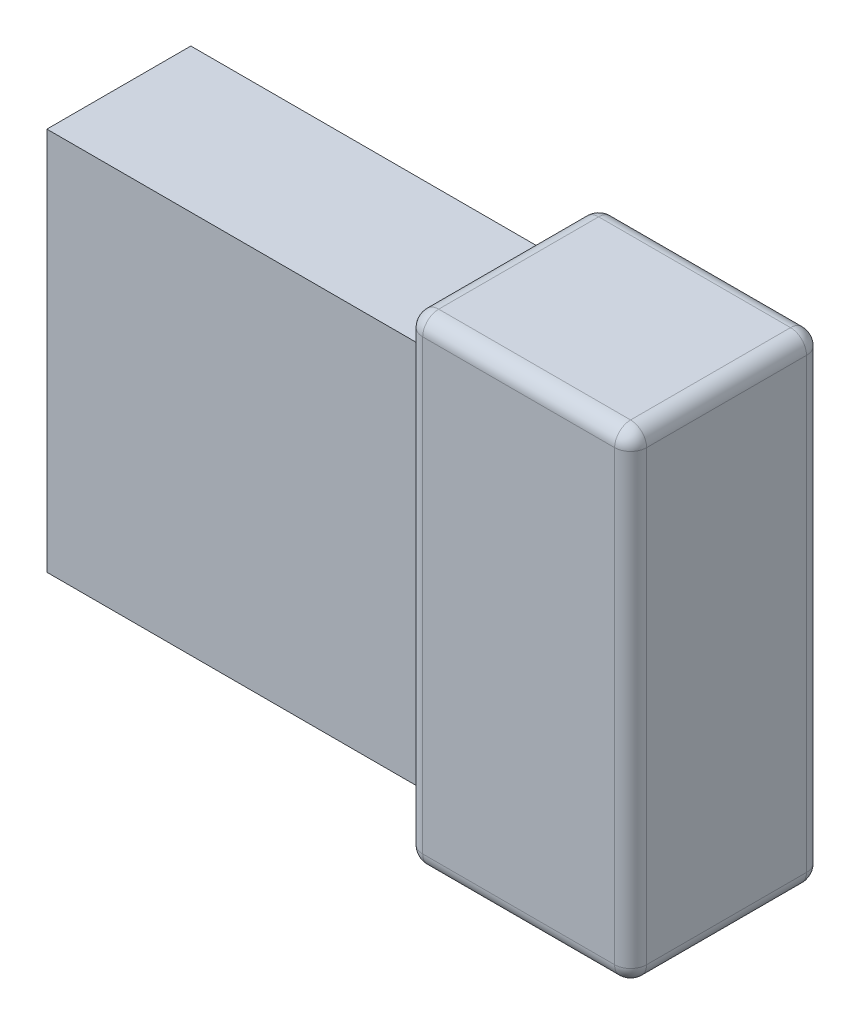
ISO-10303-21;
HEADER;
FILE_DESCRIPTION(('STEP AP214'),'2;1');
FILE_NAME('part.step','',(''),(''),'','','');
FILE_SCHEMA(('AUTOMOTIVE_DESIGN { 1 0 10303 214 1 1 1 1 }'));
ENDSEC;
DATA;
#1=APPLICATION_CONTEXT('core data for automotive mechanical design processes');
#2=APPLICATION_PROTOCOL_DEFINITION('international standard','automotive_design',2000,#1);
#3=PRODUCT_CONTEXT('',#1,'mechanical');
#4=PRODUCT('Part','Part','',(#3));
#5=PRODUCT_RELATED_PRODUCT_CATEGORY('part','',(#4));
#6=PRODUCT_DEFINITION_FORMATION('','',#4);
#7=PRODUCT_DEFINITION_CONTEXT('part definition',#1,'design');
#8=PRODUCT_DEFINITION('design','',#6,#7);
#9=PRODUCT_DEFINITION_SHAPE('','',#8);
#10=(LENGTH_UNIT() NAMED_UNIT(*) SI_UNIT(.MILLI.,.METRE.));
#11=(NAMED_UNIT(*) PLANE_ANGLE_UNIT() SI_UNIT($,.RADIAN.));
#12=(NAMED_UNIT(*) SI_UNIT($,.STERADIAN.) SOLID_ANGLE_UNIT());
#13=UNCERTAINTY_MEASURE_WITH_UNIT(LENGTH_MEASURE(1.E-05),#10,'distance_accuracy_value','');
#14=(GEOMETRIC_REPRESENTATION_CONTEXT(3) GLOBAL_UNCERTAINTY_ASSIGNED_CONTEXT((#13)) GLOBAL_UNIT_ASSIGNED_CONTEXT((#10,
#11,#12)) REPRESENTATION_CONTEXT('',''));
#15=CARTESIAN_POINT('',(0.,0.,0.));
#16=DIRECTION('',(0.,0.,1.));
#17=DIRECTION('',(1.,0.,0.));
#18=AXIS2_PLACEMENT_3D('',#15,#16,#17);
#19=CARTESIAN_POINT('',(-1.17961196366423E-13,-5.99999999999994,2.24999999999999));
#20=DIRECTION('',(0.,1.,0.));
#21=DIRECTION('',(0.,0.,1.));
#22=AXIS2_PLACEMENT_3D('',#19,#20,#21);
#23=PLANE('',#22);
#24=DIRECTION('',(1.,0.,0.));
#25=VECTOR('',#24,1.);
#26=CARTESIAN_POINT('',(-1.17961196366423E-13,-5.99999999999994,-2.25));
#27=LINE('',#26,#25);
#28=CARTESIAN_POINT('',(-6.00000000000011,-5.99999999999966,-2.25));
#29=VERTEX_POINT('',#28);
#30=CARTESIAN_POINT('',(5.99999999999992,-6.00000000000001,-2.25));
#31=VERTEX_POINT('',#30);
#32=EDGE_CURVE('E164',#29,#31,#27,.T.);
#33=ORIENTED_EDGE('',*,*,#32,.T.);
#34=DIRECTION('',(0.,0.,-1.));
#35=VECTOR('',#34,1.);
#36=CARTESIAN_POINT('',(5.99999999999992,-6.00000000000001,2.25));
#37=LINE('',#36,#35);
#38=CARTESIAN_POINT('',(5.99999999999992,-6.00000000000001,2.25));
#39=VERTEX_POINT('',#38);
#40=EDGE_CURVE('E168',#39,#31,#37,.T.);
#41=ORIENTED_EDGE('',*,*,#40,.F.);
#42=DIRECTION('',(1.,0.,0.));
#43=VECTOR('',#42,1.);
#44=CARTESIAN_POINT('',(-1.17961196366423E-13,-5.99999999999994,2.24999999999999));
#45=LINE('',#44,#43);
#46=CARTESIAN_POINT('',(-6.00000000000011,-5.99999999999966,2.25));
#47=VERTEX_POINT('',#46);
#48=EDGE_CURVE('E491',#47,#39,#45,.T.);
#49=ORIENTED_EDGE('',*,*,#48,.F.);
#50=DIRECTION('',(0.,0.,-1.));
#51=VECTOR('',#50,1.);
#52=CARTESIAN_POINT('',(-6.00000000000011,-5.99999999999966,2.25));
#53=LINE('',#52,#51);
#54=EDGE_CURVE('E170',#47,#29,#53,.T.);
#55=ORIENTED_EDGE('',*,*,#54,.T.);
#56=EDGE_LOOP('',(#33,#41,#49,#55));
#57=FACE_BOUND('',#56,.T.);
#58=ADVANCED_FACE('F38',(#57),#23,.F.);
#59=CARTESIAN_POINT('',(-1.04083408558608E-13,5.99999999999989,2.24999999999999));
#60=DIRECTION('',(0.,1.,0.));
#61=DIRECTION('',(0.,0.,1.));
#62=AXIS2_PLACEMENT_3D('',#59,#60,#61);
#63=PLANE('',#62);
#64=DIRECTION('',(1.,0.,0.));
#65=VECTOR('',#64,1.);
#66=CARTESIAN_POINT('',(-1.04083408558608E-13,5.99999999999989,-2.25));
#67=LINE('',#66,#65);
#68=CARTESIAN_POINT('',(-6.00000000000011,5.99999999999964,-2.25));
#69=VERTEX_POINT('',#68);
#70=CARTESIAN_POINT('',(5.99999999999992,6.00000000000001,-2.25));
#71=VERTEX_POINT('',#70);
#72=EDGE_CURVE('E181',#69,#71,#67,.T.);
#73=ORIENTED_EDGE('',*,*,#72,.F.);
#74=DIRECTION('',(0.,0.,-1.));
#75=VECTOR('',#74,1.);
#76=CARTESIAN_POINT('',(-6.00000000000011,5.99999999999964,2.25));
#77=LINE('',#76,#75);
#78=CARTESIAN_POINT('',(-6.00000000000011,5.99999999999964,2.25));
#79=VERTEX_POINT('',#78);
#80=EDGE_CURVE('E197',#79,#69,#77,.T.);
#81=ORIENTED_EDGE('',*,*,#80,.F.);
#82=DIRECTION('',(1.,0.,0.));
#83=VECTOR('',#82,1.);
#84=CARTESIAN_POINT('',(-1.04083408558608E-13,5.99999999999989,2.24999999999999));
#85=LINE('',#84,#83);
#86=CARTESIAN_POINT('',(5.99999999999992,6.00000000000001,2.25));
#87=VERTEX_POINT('',#86);
#88=EDGE_CURVE('E499',#79,#87,#85,.T.);
#89=ORIENTED_EDGE('',*,*,#88,.T.);
#90=DIRECTION('',(0.,0.,-1.));
#91=VECTOR('',#90,1.);
#92=CARTESIAN_POINT('',(5.99999999999992,6.00000000000001,2.25));
#93=LINE('',#92,#91);
#94=EDGE_CURVE('E190',#87,#71,#93,.T.);
#95=ORIENTED_EDGE('',*,*,#94,.T.);
#96=EDGE_LOOP('',(#73,#81,#89,#95));
#97=FACE_BOUND('',#96,.T.);
#98=ADVANCED_FACE('F422',(#97),#63,.T.);
#99=CARTESIAN_POINT('',(-6.00000000000001,0.,2.25));
#100=DIRECTION('',(-1.,0.,0.));
#101=DIRECTION('',(0.,0.,1.));
#102=AXIS2_PLACEMENT_3D('',#99,#100,#101);
#103=PLANE('',#102);
#104=DIRECTION('',(0.,1.,0.));
#105=VECTOR('',#104,1.);
#106=CARTESIAN_POINT('',(-6.00000000000001,0.,-2.25));
#107=LINE('',#106,#105);
#108=EDGE_CURVE('E489',#29,#69,#107,.T.);
#109=ORIENTED_EDGE('',*,*,#108,.F.);
#110=ORIENTED_EDGE('',*,*,#54,.F.);
#111=DIRECTION('',(0.,1.,0.));
#112=VECTOR('',#111,1.);
#113=CARTESIAN_POINT('',(-6.00000000000001,0.,2.25));
#114=LINE('',#113,#112);
#115=EDGE_CURVE('E498',#47,#79,#114,.T.);
#116=ORIENTED_EDGE('',*,*,#115,.T.);
#117=ORIENTED_EDGE('',*,*,#80,.T.);
#118=EDGE_LOOP('',(#109,#110,#116,#117));
#119=FACE_BOUND('',#118,.T.);
#120=ADVANCED_FACE('F427',(#119),#103,.T.);
#121=CARTESIAN_POINT('',(0.,0.,2.24999999999999));
#122=DIRECTION('',(0.,0.,1.));
#123=DIRECTION('',(1.,0.,0.));
#124=AXIS2_PLACEMENT_3D('',#121,#122,#123);
#125=PLANE('',#124);
#126=ORIENTED_EDGE('',*,*,#48,.T.);
#127=DIRECTION('',(0.,1.,0.));
#128=VECTOR('',#127,1.);
#129=CARTESIAN_POINT('',(6.00000000000001,0.,2.25));
#130=LINE('',#129,#128);
#131=EDGE_CURVE('E187',#39,#87,#130,.T.);
#132=ORIENTED_EDGE('',*,*,#131,.T.);
#133=ORIENTED_EDGE('',*,*,#88,.F.);
#134=ORIENTED_EDGE('',*,*,#115,.F.);
#135=EDGE_LOOP('',(#126,#132,#133,#134));
#136=FACE_BOUND('',#135,.T.);
#137=ADVANCED_FACE('F480',(#136),#125,.T.);
#138=CARTESIAN_POINT('',(0.,0.,-2.25));
#139=DIRECTION('',(0.,0.,1.));
#140=DIRECTION('',(1.,0.,0.));
#141=AXIS2_PLACEMENT_3D('',#138,#139,#140);
#142=PLANE('',#141);
#143=ORIENTED_EDGE('',*,*,#32,.F.);
#144=ORIENTED_EDGE('',*,*,#108,.T.);
#145=ORIENTED_EDGE('',*,*,#72,.T.);
#146=DIRECTION('',(0.,1.,0.));
#147=VECTOR('',#146,1.);
#148=CARTESIAN_POINT('',(6.00000000000001,0.,-2.25));
#149=LINE('',#148,#147);
#150=EDGE_CURVE('E175',#31,#71,#149,.T.);
#151=ORIENTED_EDGE('',*,*,#150,.F.);
#152=EDGE_LOOP('',(#143,#144,#145,#151));
#153=FACE_BOUND('',#152,.T.);
#154=ADVANCED_FACE('F179',(#153),#142,.F.);
#155=CARTESIAN_POINT('',(13.,-7.49999999999997,3.));
#156=DIRECTION('',(-1.,0.,0.));
#157=DIRECTION('',(0.,-1.,0.));
#158=AXIS2_PLACEMENT_3D('',#155,#156,#157);
#159=PLANE('',#158);
#160=DIRECTION('',(0.,0.,-1.));
#161=VECTOR('',#160,1.);
#162=CARTESIAN_POINT('',(13.,7.00000000000001,3.));
#163=LINE('',#162,#161);
#164=CARTESIAN_POINT('',(13.,7.00000000000001,-2.5));
#165=VERTEX_POINT('',#164);
#166=CARTESIAN_POINT('',(13.,7.00000000000001,2.5));
#167=VERTEX_POINT('',#166);
#168=EDGE_CURVE('E221',#165,#167,#163,.F.);
#169=ORIENTED_EDGE('',*,*,#168,.T.);
#170=DIRECTION('',(0.,1.,0.));
#171=VECTOR('',#170,1.);
#172=CARTESIAN_POINT('',(13.,-7.49999999999997,2.5));
#173=LINE('',#172,#171);
#174=CARTESIAN_POINT('',(13.,-7.00000000000001,2.5));
#175=VERTEX_POINT('',#174);
#176=EDGE_CURVE('E229',#167,#175,#173,.F.);
#177=ORIENTED_EDGE('',*,*,#176,.T.);
#178=DIRECTION('',(0.,0.,-1.));
#179=VECTOR('',#178,1.);
#180=CARTESIAN_POINT('',(13.,-7.00000000000001,-3.));
#181=LINE('',#180,#179);
#182=CARTESIAN_POINT('',(13.,-7.00000000000001,-2.5));
#183=VERTEX_POINT('',#182);
#184=EDGE_CURVE('E226',#175,#183,#181,.T.);
#185=ORIENTED_EDGE('',*,*,#184,.T.);
#186=DIRECTION('',(0.,1.,0.));
#187=VECTOR('',#186,1.);
#188=CARTESIAN_POINT('',(13.,-7.49999999999997,-2.5));
#189=LINE('',#188,#187);
#190=EDGE_CURVE('E223',#183,#165,#189,.T.);
#191=ORIENTED_EDGE('',*,*,#190,.T.);
#192=EDGE_LOOP('',(#169,#177,#185,#191));
#193=FACE_BOUND('',#192,.T.);
#194=ADVANCED_FACE('F388',(#193),#159,.F.);
#195=CARTESIAN_POINT('',(13.,7.49999999999997,3.));
#196=DIRECTION('',(0.,-1.,0.));
#197=DIRECTION('',(0.,0.,-1.));
#198=AXIS2_PLACEMENT_3D('',#195,#196,#197);
#199=PLANE('',#198);
#200=DIRECTION('',(-1.,0.,0.));
#201=VECTOR('',#200,1.);
#202=CARTESIAN_POINT('',(13.,7.49999999999997,2.5));
#203=LINE('',#202,#201);
#204=CARTESIAN_POINT('',(6.50000000000001,7.50000000000001,2.5));
#205=VERTEX_POINT('',#204);
#206=CARTESIAN_POINT('',(12.5,7.49999999999996,2.5));
#207=VERTEX_POINT('',#206);
#208=EDGE_CURVE('E47',#205,#207,#203,.F.);
#209=ORIENTED_EDGE('',*,*,#208,.T.);
#210=DIRECTION('',(0.,0.,-1.));
#211=VECTOR('',#210,1.);
#212=CARTESIAN_POINT('',(12.5,7.49999999999996,3.));
#213=LINE('',#212,#211);
#214=CARTESIAN_POINT('',(12.5,7.49999999999996,-2.5));
#215=VERTEX_POINT('',#214);
#216=EDGE_CURVE('E11',#207,#215,#213,.T.);
#217=ORIENTED_EDGE('',*,*,#216,.T.);
#218=DIRECTION('',(-1.,0.,0.));
#219=VECTOR('',#218,1.);
#220=CARTESIAN_POINT('',(13.,7.49999999999997,-2.5));
#221=LINE('',#220,#219);
#222=CARTESIAN_POINT('',(6.50000000000001,7.50000000000001,-2.5));
#223=VERTEX_POINT('',#222);
#224=EDGE_CURVE('E259',#215,#223,#221,.T.);
#225=ORIENTED_EDGE('',*,*,#224,.T.);
#226=DIRECTION('',(0.,0.,-1.));
#227=VECTOR('',#226,1.);
#228=CARTESIAN_POINT('',(6.50000000000001,7.50000000000001,3.));
#229=LINE('',#228,#227);
#230=EDGE_CURVE('E58',#223,#205,#229,.F.);
#231=ORIENTED_EDGE('',*,*,#230,.T.);
#232=EDGE_LOOP('',(#209,#217,#225,#231));
#233=FACE_BOUND('',#232,.T.);
#234=ADVANCED_FACE('F468',(#233),#199,.F.);
#235=CARTESIAN_POINT('',(5.99999999999999,-7.50000000000009,3.));
#236=DIRECTION('',(-1.,0.,0.));
#237=DIRECTION('',(0.,0.,1.));
#238=AXIS2_PLACEMENT_3D('',#235,#236,#237);
#239=PLANE('',#238);
#240=DIRECTION('',(0.,0.,-1.));
#241=VECTOR('',#240,1.);
#242=CARTESIAN_POINT('',(5.99999999999999,-7.00000000000009,3.));
#243=LINE('',#242,#241);
#244=CARTESIAN_POINT('',(5.99999999999999,-7.00000000000009,-2.5));
#245=VERTEX_POINT('',#244);
#246=CARTESIAN_POINT('',(5.99999999999999,-7.00000000000009,2.5));
#247=VERTEX_POINT('',#246);
#248=EDGE_CURVE('E203',#245,#247,#243,.F.);
#249=ORIENTED_EDGE('',*,*,#248,.T.);
#250=DIRECTION('',(0.,1.,0.));
#251=VECTOR('',#250,1.);
#252=CARTESIAN_POINT('',(5.99999999999999,-7.50000000000009,2.5));
#253=LINE('',#252,#251);
#254=CARTESIAN_POINT('',(6.00000000000001,7.00000000000009,2.5));
#255=VERTEX_POINT('',#254);
#256=EDGE_CURVE('E205',#247,#255,#253,.T.);
#257=ORIENTED_EDGE('',*,*,#256,.T.);
#258=DIRECTION('',(0.,0.,-1.));
#259=VECTOR('',#258,1.);
#260=CARTESIAN_POINT('',(6.00000000000001,7.00000000000009,-3.));
#261=LINE('',#260,#259);
#262=CARTESIAN_POINT('',(6.00000000000001,7.00000000000009,-2.5));
#263=VERTEX_POINT('',#262);
#264=EDGE_CURVE('E189',#255,#263,#261,.T.);
#265=ORIENTED_EDGE('',*,*,#264,.T.);
#266=DIRECTION('',(0.,1.,0.));
#267=VECTOR('',#266,1.);
#268=CARTESIAN_POINT('',(5.99999999999999,-7.50000000000009,-2.5));
#269=LINE('',#268,#267);
#270=EDGE_CURVE('E194',#263,#245,#269,.F.);
#271=ORIENTED_EDGE('',*,*,#270,.T.);
#272=EDGE_LOOP('',(#249,#257,#265,#271));
#273=FACE_BOUND('',#272,.T.);
#274=ORIENTED_EDGE('',*,*,#40,.T.);
#275=ORIENTED_EDGE('',*,*,#150,.T.);
#276=ORIENTED_EDGE('',*,*,#94,.F.);
#277=ORIENTED_EDGE('',*,*,#131,.F.);
#278=EDGE_LOOP('',(#274,#275,#276,#277));
#279=FACE_BOUND('',#278,.T.);
#280=ADVANCED_FACE('F186',(#273,#279),#239,.T.);
#281=CARTESIAN_POINT('',(13.,-7.49999999999997,3.));
#282=DIRECTION('',(0.,-1.,0.));
#283=DIRECTION('',(1.,0.,0.));
#284=AXIS2_PLACEMENT_3D('',#281,#282,#283);
#285=PLANE('',#284);
#286=DIRECTION('',(-1.,0.,0.));
#287=VECTOR('',#286,1.);
#288=CARTESIAN_POINT('',(13.,-7.49999999999997,2.5));
#289=LINE('',#288,#287);
#290=CARTESIAN_POINT('',(12.5,-7.49999999999997,2.5));
#291=VERTEX_POINT('',#290);
#292=CARTESIAN_POINT('',(6.49999999999999,-7.50000000000001,2.5));
#293=VERTEX_POINT('',#292);
#294=EDGE_CURVE('E239',#291,#293,#289,.T.);
#295=ORIENTED_EDGE('',*,*,#294,.T.);
#296=DIRECTION('',(0.,0.,-1.));
#297=VECTOR('',#296,1.);
#298=CARTESIAN_POINT('',(6.49999999999999,-7.50000000000001,3.));
#299=LINE('',#298,#297);
#300=CARTESIAN_POINT('',(6.49999999999999,-7.50000000000001,-2.5));
#301=VERTEX_POINT('',#300);
#302=EDGE_CURVE('E242',#293,#301,#299,.T.);
#303=ORIENTED_EDGE('',*,*,#302,.T.);
#304=DIRECTION('',(-1.,0.,0.));
#305=VECTOR('',#304,1.);
#306=CARTESIAN_POINT('',(13.,-7.49999999999997,-2.50000000000002));
#307=LINE('',#306,#305);
#308=CARTESIAN_POINT('',(12.5,-7.49999999999997,-2.5));
#309=VERTEX_POINT('',#308);
#310=EDGE_CURVE('E233',#301,#309,#307,.F.);
#311=ORIENTED_EDGE('',*,*,#310,.T.);
#312=DIRECTION('',(0.,0.,-1.));
#313=VECTOR('',#312,1.);
#314=CARTESIAN_POINT('',(12.5,-7.49999999999997,3.));
#315=LINE('',#314,#313);
#316=EDGE_CURVE('E236',#309,#291,#315,.F.);
#317=ORIENTED_EDGE('',*,*,#316,.T.);
#318=EDGE_LOOP('',(#295,#303,#311,#317));
#319=FACE_BOUND('',#318,.T.);
#320=ADVANCED_FACE('F359',(#319),#285,.T.);
#321=CARTESIAN_POINT('',(0.,0.,2.99999999999999));
#322=DIRECTION('',(0.,0.,1.));
#323=DIRECTION('',(1.,0.,0.));
#324=AXIS2_PLACEMENT_3D('',#321,#322,#323);
#325=PLANE('',#324);
#326=DIRECTION('',(0.,1.,0.));
#327=VECTOR('',#326,1.);
#328=CARTESIAN_POINT('',(6.50000000000001,0.,3.));
#329=LINE('',#328,#327);
#330=CARTESIAN_POINT('',(6.50000000000001,7.00000000000001,3.));
#331=VERTEX_POINT('',#330);
#332=CARTESIAN_POINT('',(6.49999999999999,-7.00000000000001,3.));
#333=VERTEX_POINT('',#332);
#334=EDGE_CURVE('E214',#331,#333,#329,.F.);
#335=ORIENTED_EDGE('',*,*,#334,.T.);
#336=DIRECTION('',(-1.,0.,0.));
#337=VECTOR('',#336,1.);
#338=CARTESIAN_POINT('',(0.,-6.99999999999994,2.99999999999999));
#339=LINE('',#338,#337);
#340=CARTESIAN_POINT('',(12.5,-7.00000000000001,3.));
#341=VERTEX_POINT('',#340);
#342=EDGE_CURVE('E218',#333,#341,#339,.F.);
#343=ORIENTED_EDGE('',*,*,#342,.T.);
#344=DIRECTION('',(0.,1.,0.));
#345=VECTOR('',#344,1.);
#346=CARTESIAN_POINT('',(12.5,7.49999999999996,3.));
#347=LINE('',#346,#345);
#348=CARTESIAN_POINT('',(12.5,7.,3.));
#349=VERTEX_POINT('',#348);
#350=EDGE_CURVE('E211',#341,#349,#347,.T.);
#351=ORIENTED_EDGE('',*,*,#350,.T.);
#352=DIRECTION('',(-1.,0.,0.));
#353=VECTOR('',#352,1.);
#354=CARTESIAN_POINT('',(6.00000000000001,7.00000000000009,3.));
#355=LINE('',#354,#353);
#356=EDGE_CURVE('E209',#349,#331,#355,.T.);
#357=ORIENTED_EDGE('',*,*,#356,.T.);
#358=EDGE_LOOP('',(#335,#343,#351,#357));
#359=FACE_BOUND('',#358,.T.);
#360=ADVANCED_FACE('F462',(#359),#325,.T.);
#361=CARTESIAN_POINT('',(0.,0.,-3.));
#362=DIRECTION('',(0.,0.,1.));
#363=DIRECTION('',(1.,0.,0.));
#364=AXIS2_PLACEMENT_3D('',#361,#362,#363);
#365=PLANE('',#364);
#366=DIRECTION('',(-1.,0.,0.));
#367=VECTOR('',#366,1.);
#368=CARTESIAN_POINT('',(5.99999999999999,-7.00000000000009,-3.));
#369=LINE('',#368,#367);
#370=CARTESIAN_POINT('',(12.5,-7.00000000000001,-3.));
#371=VERTEX_POINT('',#370);
#372=CARTESIAN_POINT('',(6.49999999999999,-7.00000000000001,-3.));
#373=VERTEX_POINT('',#372);
#374=EDGE_CURVE('E252',#371,#373,#369,.T.);
#375=ORIENTED_EDGE('',*,*,#374,.T.);
#376=DIRECTION('',(0.,1.,0.));
#377=VECTOR('',#376,1.);
#378=CARTESIAN_POINT('',(6.50000000000001,7.50000000000001,-3.));
#379=LINE('',#378,#377);
#380=CARTESIAN_POINT('',(6.50000000000001,7.00000000000001,-3.));
#381=VERTEX_POINT('',#380);
#382=EDGE_CURVE('E255',#373,#381,#379,.T.);
#383=ORIENTED_EDGE('',*,*,#382,.T.);
#384=DIRECTION('',(-1.,0.,0.));
#385=VECTOR('',#384,1.);
#386=CARTESIAN_POINT('',(0.,6.99999999999987,-3.));
#387=LINE('',#386,#385);
#388=CARTESIAN_POINT('',(12.5,7.,-3.));
#389=VERTEX_POINT('',#388);
#390=EDGE_CURVE('E246',#381,#389,#387,.F.);
#391=ORIENTED_EDGE('',*,*,#390,.T.);
#392=DIRECTION('',(0.,1.,0.));
#393=VECTOR('',#392,1.);
#394=CARTESIAN_POINT('',(12.5,0.,-3.));
#395=LINE('',#394,#393);
#396=EDGE_CURVE('E249',#389,#371,#395,.F.);
#397=ORIENTED_EDGE('',*,*,#396,.T.);
#398=EDGE_LOOP('',(#375,#383,#391,#397));
#399=FACE_BOUND('',#398,.T.);
#400=ADVANCED_FACE('F368',(#399),#365,.F.);
#401=CARTESIAN_POINT('',(12.5,-7.49999999999997,-2.5));
#402=DIRECTION('',(0.,1.,0.));
#403=DIRECTION('',(-1.,0.,0.));
#404=AXIS2_PLACEMENT_3D('',#401,#402,#403);
#405=CYLINDRICAL_SURFACE('',#404,0.5);
#406=CARTESIAN_POINT('',(12.5,-7.00000000000001,-2.5));
#407=DIRECTION('',(0.,-1.,0.));
#408=DIRECTION('',(0.,0.,-1.));
#409=AXIS2_PLACEMENT_3D('',#406,#407,#408);
#410=CIRCLE('',#409,0.5);
#411=EDGE_CURVE('E42',#371,#183,#410,.T.);
#412=ORIENTED_EDGE('',*,*,#411,.F.);
#413=ORIENTED_EDGE('',*,*,#396,.F.);
#414=CARTESIAN_POINT('',(12.5,7.,-2.5));
#415=DIRECTION('',(0.,1.,0.));
#416=DIRECTION('',(0.,0.,1.));
#417=AXIS2_PLACEMENT_3D('',#414,#415,#416);
#418=CIRCLE('',#417,0.5);
#419=EDGE_CURVE('E335',#165,#389,#418,.T.);
#420=ORIENTED_EDGE('',*,*,#419,.F.);
#421=ORIENTED_EDGE('',*,*,#190,.F.);
#422=EDGE_LOOP('',(#412,#413,#420,#421));
#423=FACE_BOUND('',#422,.T.);
#424=ADVANCED_FACE('F40',(#423),#405,.T.);
#425=CARTESIAN_POINT('',(12.5,-7.00000000000001,-2.5));
#426=DIRECTION('',(0.,0.,1.));
#427=DIRECTION('',(1.,0.,0.));
#428=AXIS2_PLACEMENT_3D('',#425,#426,#427);
#429=SPHERICAL_SURFACE('',#428,0.5);
#430=CARTESIAN_POINT('',(12.5,-7.00000000000001,-2.5));
#431=DIRECTION('',(1.,0.,0.));
#432=DIRECTION('',(0.,0.,-1.));
#433=AXIS2_PLACEMENT_3D('',#430,#431,#432);
#434=CIRCLE('',#433,0.5);
#435=EDGE_CURVE('E328',#371,#309,#434,.F.);
#436=ORIENTED_EDGE('',*,*,#435,.F.);
#437=ORIENTED_EDGE('',*,*,#411,.T.);
#438=CARTESIAN_POINT('',(12.5,-7.00000000000001,-2.5));
#439=DIRECTION('',(0.,0.,-1.));
#440=DIRECTION('',(0.,1.,0.));
#441=AXIS2_PLACEMENT_3D('',#438,#439,#440);
#442=CIRCLE('',#441,0.5);
#443=EDGE_CURVE('E332',#309,#183,#442,.F.);
#444=ORIENTED_EDGE('',*,*,#443,.F.);
#445=EDGE_LOOP('',(#436,#437,#444));
#446=FACE_BOUND('',#445,.T.);
#447=ADVANCED_FACE('F347',(#446),#429,.T.);
#448=CARTESIAN_POINT('',(12.5,7.,-2.5));
#449=DIRECTION('',(0.,0.,1.));
#450=DIRECTION('',(1.,0.,0.));
#451=AXIS2_PLACEMENT_3D('',#448,#449,#450);
#452=SPHERICAL_SURFACE('',#451,0.5);
#453=CARTESIAN_POINT('',(12.5,7.,-2.5));
#454=DIRECTION('',(0.,0.,-1.));
#455=DIRECTION('',(-1.,0.,0.));
#456=AXIS2_PLACEMENT_3D('',#453,#454,#455);
#457=CIRCLE('',#456,0.5);
#458=EDGE_CURVE('E322',#165,#215,#457,.F.);
#459=ORIENTED_EDGE('',*,*,#458,.F.);
#460=ORIENTED_EDGE('',*,*,#419,.T.);
#461=CARTESIAN_POINT('',(12.5,7.,-2.5));
#462=DIRECTION('',(1.,0.,0.));
#463=DIRECTION('',(0.,0.,-1.));
#464=AXIS2_PLACEMENT_3D('',#461,#462,#463);
#465=CIRCLE('',#464,0.5);
#466=EDGE_CURVE('E325',#215,#389,#465,.F.);
#467=ORIENTED_EDGE('',*,*,#466,.F.);
#468=EDGE_LOOP('',(#459,#460,#467));
#469=FACE_BOUND('',#468,.T.);
#470=ADVANCED_FACE('F382',(#469),#452,.T.);
#471=CARTESIAN_POINT('',(12.5,-7.00000000000001,3.));
#472=DIRECTION('',(0.,0.,1.));
#473=DIRECTION('',(1.,0.,0.));
#474=AXIS2_PLACEMENT_3D('',#471,#472,#473);
#475=CYLINDRICAL_SURFACE('',#474,0.5);
#476=ORIENTED_EDGE('',*,*,#443,.T.);
#477=ORIENTED_EDGE('',*,*,#184,.F.);
#478=CARTESIAN_POINT('',(12.5,-7.00000000000001,2.5));
#479=DIRECTION('',(0.,0.,1.));
#480=DIRECTION('',(1.,0.,0.));
#481=AXIS2_PLACEMENT_3D('',#478,#479,#480);
#482=CIRCLE('',#481,0.5);
#483=EDGE_CURVE('E317',#291,#175,#482,.T.);
#484=ORIENTED_EDGE('',*,*,#483,.F.);
#485=ORIENTED_EDGE('',*,*,#316,.F.);
#486=EDGE_LOOP('',(#476,#477,#484,#485));
#487=FACE_BOUND('',#486,.T.);
#488=ADVANCED_FACE('F355',(#487),#475,.T.);
#489=CARTESIAN_POINT('',(0.,-6.99999999999994,-2.5));
#490=DIRECTION('',(1.,0.,0.));
#491=DIRECTION('',(0.,1.,0.));
#492=AXIS2_PLACEMENT_3D('',#489,#490,#491);
#493=CYLINDRICAL_SURFACE('',#492,0.5);
#494=ORIENTED_EDGE('',*,*,#435,.T.);
#495=ORIENTED_EDGE('',*,*,#310,.F.);
#496=CARTESIAN_POINT('',(6.49999999999999,-7.00000000000001,-2.5));
#497=DIRECTION('',(-1.,0.,0.));
#498=DIRECTION('',(0.,0.,1.));
#499=AXIS2_PLACEMENT_3D('',#496,#497,#498);
#500=CIRCLE('',#499,0.5);
#501=EDGE_CURVE('E313',#373,#301,#500,.T.);
#502=ORIENTED_EDGE('',*,*,#501,.F.);
#503=ORIENTED_EDGE('',*,*,#374,.F.);
#504=EDGE_LOOP('',(#494,#495,#502,#503));
#505=FACE_BOUND('',#504,.T.);
#506=ADVANCED_FACE('F365',(#505),#493,.T.);
#507=CARTESIAN_POINT('',(6.50000000000001,0.,-2.5));
#508=DIRECTION('',(0.,-1.,0.));
#509=DIRECTION('',(0.,0.,-1.));
#510=AXIS2_PLACEMENT_3D('',#507,#508,#509);
#511=CYLINDRICAL_SURFACE('',#510,0.5);
#512=CARTESIAN_POINT('',(6.50000000000001,7.00000000000001,-2.5));
#513=DIRECTION('',(0.,1.,0.));
#514=DIRECTION('',(0.,0.,1.));
#515=AXIS2_PLACEMENT_3D('',#512,#513,#514);
#516=CIRCLE('',#515,0.5);
#517=EDGE_CURVE('E305',#381,#263,#516,.T.);
#518=ORIENTED_EDGE('',*,*,#517,.F.);
#519=ORIENTED_EDGE('',*,*,#382,.F.);
#520=CARTESIAN_POINT('',(6.49999999999999,-7.00000000000001,-2.5));
#521=DIRECTION('',(0.,-1.,0.));
#522=DIRECTION('',(0.,0.,-1.));
#523=AXIS2_PLACEMENT_3D('',#520,#521,#522);
#524=CIRCLE('',#523,0.5);
#525=EDGE_CURVE('E309',#245,#373,#524,.T.);
#526=ORIENTED_EDGE('',*,*,#525,.F.);
#527=ORIENTED_EDGE('',*,*,#270,.F.);
#528=EDGE_LOOP('',(#518,#519,#526,#527));
#529=FACE_BOUND('',#528,.T.);
#530=ADVANCED_FACE('F372',(#529),#511,.T.);
#531=CARTESIAN_POINT('',(13.,7.00000000000001,-2.5));
#532=DIRECTION('',(-1.,0.,0.));
#533=DIRECTION('',(0.,0.,1.));
#534=AXIS2_PLACEMENT_3D('',#531,#532,#533);
#535=CYLINDRICAL_SURFACE('',#534,0.5);
#536=ORIENTED_EDGE('',*,*,#466,.T.);
#537=ORIENTED_EDGE('',*,*,#390,.F.);
#538=CARTESIAN_POINT('',(6.50000000000001,7.00000000000001,-2.5));
#539=DIRECTION('',(-1.,0.,0.));
#540=DIRECTION('',(0.,0.,1.));
#541=AXIS2_PLACEMENT_3D('',#538,#539,#540);
#542=CIRCLE('',#541,0.5);
#543=EDGE_CURVE('E302',#223,#381,#542,.T.);
#544=ORIENTED_EDGE('',*,*,#543,.F.);
#545=ORIENTED_EDGE('',*,*,#224,.F.);
#546=EDGE_LOOP('',(#536,#537,#544,#545));
#547=FACE_BOUND('',#546,.T.);
#548=ADVANCED_FACE('F380',(#547),#535,.T.);
#549=CARTESIAN_POINT('',(12.5,7.,3.));
#550=DIRECTION('',(0.,0.,-1.));
#551=DIRECTION('',(-1.,0.,0.));
#552=AXIS2_PLACEMENT_3D('',#549,#550,#551);
#553=CYLINDRICAL_SURFACE('',#552,0.5);
#554=ORIENTED_EDGE('',*,*,#458,.T.);
#555=ORIENTED_EDGE('',*,*,#216,.F.);
#556=CARTESIAN_POINT('',(12.5,7.,2.5));
#557=DIRECTION('',(0.,0.,1.));
#558=DIRECTION('',(1.,0.,0.));
#559=AXIS2_PLACEMENT_3D('',#556,#557,#558);
#560=CIRCLE('',#559,0.5);
#561=EDGE_CURVE('E299',#167,#207,#560,.T.);
#562=ORIENTED_EDGE('',*,*,#561,.F.);
#563=ORIENTED_EDGE('',*,*,#168,.F.);
#564=EDGE_LOOP('',(#554,#555,#562,#563));
#565=FACE_BOUND('',#564,.T.);
#566=ADVANCED_FACE('F385',(#565),#553,.T.);
#567=CARTESIAN_POINT('',(12.5,0.,2.5));
#568=DIRECTION('',(0.,-1.,0.));
#569=DIRECTION('',(1.,0.,0.));
#570=AXIS2_PLACEMENT_3D('',#567,#568,#569);
#571=CYLINDRICAL_SURFACE('',#570,0.5);
#572=CARTESIAN_POINT('',(12.5,-7.00000000000001,2.5));
#573=DIRECTION('',(0.,-1.,0.));
#574=DIRECTION('',(0.,0.,-1.));
#575=AXIS2_PLACEMENT_3D('',#572,#573,#574);
#576=CIRCLE('',#575,0.5);
#577=EDGE_CURVE('E319',#175,#341,#576,.T.);
#578=ORIENTED_EDGE('',*,*,#577,.F.);
#579=ORIENTED_EDGE('',*,*,#176,.F.);
#580=CARTESIAN_POINT('',(12.5,7.,2.5));
#581=DIRECTION('',(0.,1.,0.));
#582=DIRECTION('',(0.,0.,1.));
#583=AXIS2_PLACEMENT_3D('',#580,#581,#582);
#584=CIRCLE('',#583,0.5);
#585=EDGE_CURVE('E296',#349,#167,#584,.T.);
#586=ORIENTED_EDGE('',*,*,#585,.F.);
#587=ORIENTED_EDGE('',*,*,#350,.F.);
#588=EDGE_LOOP('',(#578,#579,#586,#587));
#589=FACE_BOUND('',#588,.T.);
#590=ADVANCED_FACE('F392',(#589),#571,.T.);
#591=CARTESIAN_POINT('',(12.5,-7.00000000000001,2.5));
#592=DIRECTION('',(0.,0.,1.));
#593=DIRECTION('',(1.,0.,0.));
#594=AXIS2_PLACEMENT_3D('',#591,#592,#593);
#595=SPHERICAL_SURFACE('',#594,0.5);
#596=ORIENTED_EDGE('',*,*,#483,.T.);
#597=ORIENTED_EDGE('',*,*,#577,.T.);
#598=CARTESIAN_POINT('',(12.5,-7.00000000000001,2.5));
#599=DIRECTION('',(1.,0.,0.));
#600=DIRECTION('',(0.,1.,0.));
#601=AXIS2_PLACEMENT_3D('',#598,#599,#600);
#602=CIRCLE('',#601,0.5);
#603=EDGE_CURVE('E293',#291,#341,#602,.F.);
#604=ORIENTED_EDGE('',*,*,#603,.F.);
#605=EDGE_LOOP('',(#596,#597,#604));
#606=FACE_BOUND('',#605,.T.);
#607=ADVANCED_FACE('F396',(#606),#595,.T.);
#608=CARTESIAN_POINT('',(6.49999999999999,-7.00000000000001,-2.5));
#609=DIRECTION('',(0.,0.,1.));
#610=DIRECTION('',(1.,0.,0.));
#611=AXIS2_PLACEMENT_3D('',#608,#609,#610);
#612=SPHERICAL_SURFACE('',#611,0.5);
#613=ORIENTED_EDGE('',*,*,#525,.T.);
#614=ORIENTED_EDGE('',*,*,#501,.T.);
#615=CARTESIAN_POINT('',(6.49999999999999,-7.00000000000001,-2.5));
#616=DIRECTION('',(0.,0.,-1.));
#617=DIRECTION('',(-1.,0.,0.));
#618=AXIS2_PLACEMENT_3D('',#615,#616,#617);
#619=CIRCLE('',#618,0.5);
#620=EDGE_CURVE('E291',#245,#301,#619,.F.);
#621=ORIENTED_EDGE('',*,*,#620,.F.);
#622=EDGE_LOOP('',(#613,#614,#621));
#623=FACE_BOUND('',#622,.T.);
#624=ADVANCED_FACE('F410',(#623),#612,.T.);
#625=CARTESIAN_POINT('',(6.50000000000001,7.00000000000001,-2.5));
#626=DIRECTION('',(0.,0.,1.));
#627=DIRECTION('',(1.,0.,0.));
#628=AXIS2_PLACEMENT_3D('',#625,#626,#627);
#629=SPHERICAL_SURFACE('',#628,0.5);
#630=ORIENTED_EDGE('',*,*,#543,.T.);
#631=ORIENTED_EDGE('',*,*,#517,.T.);
#632=CARTESIAN_POINT('',(6.50000000000001,7.00000000000001,-2.5));
#633=DIRECTION('',(0.,0.,-1.));
#634=DIRECTION('',(0.,1.,0.));
#635=AXIS2_PLACEMENT_3D('',#632,#633,#634);
#636=CIRCLE('',#635,0.5);
#637=EDGE_CURVE('E287',#223,#263,#636,.F.);
#638=ORIENTED_EDGE('',*,*,#637,.F.);
#639=EDGE_LOOP('',(#630,#631,#638));
#640=FACE_BOUND('',#639,.T.);
#641=ADVANCED_FACE('F412',(#640),#629,.T.);
#642=CARTESIAN_POINT('',(12.5,7.,2.5));
#643=DIRECTION('',(0.,0.,1.));
#644=DIRECTION('',(1.,0.,0.));
#645=AXIS2_PLACEMENT_3D('',#642,#643,#644);
#646=SPHERICAL_SURFACE('',#645,0.5);
#647=ORIENTED_EDGE('',*,*,#585,.T.);
#648=ORIENTED_EDGE('',*,*,#561,.T.);
#649=CARTESIAN_POINT('',(12.5,7.,2.5));
#650=DIRECTION('',(1.,0.,0.));
#651=DIRECTION('',(0.,0.,-1.));
#652=AXIS2_PLACEMENT_3D('',#649,#650,#651);
#653=CIRCLE('',#652,0.5);
#654=EDGE_CURVE('E284',#349,#207,#653,.F.);
#655=ORIENTED_EDGE('',*,*,#654,.F.);
#656=EDGE_LOOP('',(#647,#648,#655));
#657=FACE_BOUND('',#656,.T.);
#658=ADVANCED_FACE('F418',(#657),#646,.T.);
#659=CARTESIAN_POINT('',(13.,-7.00000000000001,2.5));
#660=DIRECTION('',(-1.,0.,0.));
#661=DIRECTION('',(0.,-1.,0.));
#662=AXIS2_PLACEMENT_3D('',#659,#660,#661);
#663=CYLINDRICAL_SURFACE('',#662,0.5);
#664=ORIENTED_EDGE('',*,*,#603,.T.);
#665=ORIENTED_EDGE('',*,*,#342,.F.);
#666=CARTESIAN_POINT('',(6.49999999999999,-7.00000000000001,2.5));
#667=DIRECTION('',(-1.,0.,0.));
#668=DIRECTION('',(0.,0.,1.));
#669=AXIS2_PLACEMENT_3D('',#666,#667,#668);
#670=CIRCLE('',#669,0.5);
#671=EDGE_CURVE('E280',#293,#333,#670,.T.);
#672=ORIENTED_EDGE('',*,*,#671,.F.);
#673=ORIENTED_EDGE('',*,*,#294,.F.);
#674=EDGE_LOOP('',(#664,#665,#672,#673));
#675=FACE_BOUND('',#674,.T.);
#676=ADVANCED_FACE('F399',(#675),#663,.T.);
#677=CARTESIAN_POINT('',(6.49999999999999,-7.00000000000001,3.));
#678=DIRECTION('',(0.,0.,-1.));
#679=DIRECTION('',(-1.,0.,0.));
#680=AXIS2_PLACEMENT_3D('',#677,#678,#679);
#681=CYLINDRICAL_SURFACE('',#680,0.5);
#682=ORIENTED_EDGE('',*,*,#620,.T.);
#683=ORIENTED_EDGE('',*,*,#302,.F.);
#684=CARTESIAN_POINT('',(6.49999999999999,-7.00000000000001,2.5));
#685=DIRECTION('',(0.,0.,1.));
#686=DIRECTION('',(1.,0.,0.));
#687=AXIS2_PLACEMENT_3D('',#684,#685,#686);
#688=CIRCLE('',#687,0.5);
#689=EDGE_CURVE('E276',#247,#293,#688,.T.);
#690=ORIENTED_EDGE('',*,*,#689,.F.);
#691=ORIENTED_EDGE('',*,*,#248,.F.);
#692=EDGE_LOOP('',(#682,#683,#690,#691));
#693=FACE_BOUND('',#692,.T.);
#694=ADVANCED_FACE('F408',(#693),#681,.T.);
#695=CARTESIAN_POINT('',(6.50000000000001,7.00000000000001,3.));
#696=DIRECTION('',(0.,0.,1.));
#697=DIRECTION('',(1.,0.,0.));
#698=AXIS2_PLACEMENT_3D('',#695,#696,#697);
#699=CYLINDRICAL_SURFACE('',#698,0.5);
#700=ORIENTED_EDGE('',*,*,#637,.T.);
#701=ORIENTED_EDGE('',*,*,#264,.F.);
#702=CARTESIAN_POINT('',(6.50000000000001,7.00000000000001,2.5));
#703=DIRECTION('',(0.,0.,1.));
#704=DIRECTION('',(1.,0.,0.));
#705=AXIS2_PLACEMENT_3D('',#702,#703,#704);
#706=CIRCLE('',#705,0.5);
#707=EDGE_CURVE('E273',#205,#255,#706,.T.);
#708=ORIENTED_EDGE('',*,*,#707,.F.);
#709=ORIENTED_EDGE('',*,*,#230,.F.);
#710=EDGE_LOOP('',(#700,#701,#708,#709));
#711=FACE_BOUND('',#710,.T.);
#712=ADVANCED_FACE('F445',(#711),#699,.T.);
#713=CARTESIAN_POINT('',(0.,6.99999999999987,2.49999999999999));
#714=DIRECTION('',(1.,0.,0.));
#715=DIRECTION('',(0.,0.,-1.));
#716=AXIS2_PLACEMENT_3D('',#713,#714,#715);
#717=CYLINDRICAL_SURFACE('',#716,0.5);
#718=ORIENTED_EDGE('',*,*,#654,.T.);
#719=ORIENTED_EDGE('',*,*,#208,.F.);
#720=CARTESIAN_POINT('',(6.50000000000001,7.00000000000001,2.5));
#721=DIRECTION('',(-1.,0.,0.));
#722=DIRECTION('',(0.,0.,1.));
#723=AXIS2_PLACEMENT_3D('',#720,#721,#722);
#724=CIRCLE('',#723,0.5);
#725=EDGE_CURVE('E270',#331,#205,#724,.T.);
#726=ORIENTED_EDGE('',*,*,#725,.F.);
#727=ORIENTED_EDGE('',*,*,#356,.F.);
#728=EDGE_LOOP('',(#718,#719,#726,#727));
#729=FACE_BOUND('',#728,.T.);
#730=ADVANCED_FACE('F442',(#729),#717,.T.);
#731=CARTESIAN_POINT('',(6.49999999999999,-7.00000000000001,2.5));
#732=DIRECTION('',(0.,0.,1.));
#733=DIRECTION('',(1.,0.,0.));
#734=AXIS2_PLACEMENT_3D('',#731,#732,#733);
#735=SPHERICAL_SURFACE('',#734,0.5);
#736=ORIENTED_EDGE('',*,*,#689,.T.);
#737=ORIENTED_EDGE('',*,*,#671,.T.);
#738=CARTESIAN_POINT('',(6.49999999999999,-7.00000000000001,2.5));
#739=DIRECTION('',(0.,-1.,0.));
#740=DIRECTION('',(0.,0.,-1.));
#741=AXIS2_PLACEMENT_3D('',#738,#739,#740);
#742=CIRCLE('',#741,0.5);
#743=EDGE_CURVE('E267',#247,#333,#742,.F.);
#744=ORIENTED_EDGE('',*,*,#743,.F.);
#745=EDGE_LOOP('',(#736,#737,#744));
#746=FACE_BOUND('',#745,.T.);
#747=ADVANCED_FACE('F404',(#746),#735,.T.);
#748=CARTESIAN_POINT('',(6.50000000000001,7.00000000000001,2.5));
#749=DIRECTION('',(0.,0.,1.));
#750=DIRECTION('',(1.,0.,0.));
#751=AXIS2_PLACEMENT_3D('',#748,#749,#750);
#752=SPHERICAL_SURFACE('',#751,0.5);
#753=ORIENTED_EDGE('',*,*,#725,.T.);
#754=ORIENTED_EDGE('',*,*,#707,.T.);
#755=CARTESIAN_POINT('',(6.50000000000001,7.00000000000001,2.5));
#756=DIRECTION('',(0.,1.,0.));
#757=DIRECTION('',(0.,0.,1.));
#758=AXIS2_PLACEMENT_3D('',#755,#756,#757);
#759=CIRCLE('',#758,0.5);
#760=EDGE_CURVE('E265',#331,#255,#759,.F.);
#761=ORIENTED_EDGE('',*,*,#760,.F.);
#762=EDGE_LOOP('',(#753,#754,#761));
#763=FACE_BOUND('',#762,.T.);
#764=ADVANCED_FACE('F435',(#763),#752,.T.);
#765=CARTESIAN_POINT('',(6.49999999999999,-7.50000000000001,2.5));
#766=DIRECTION('',(0.,1.,0.));
#767=DIRECTION('',(0.,0.,1.));
#768=AXIS2_PLACEMENT_3D('',#765,#766,#767);
#769=CYLINDRICAL_SURFACE('',#768,0.5);
#770=ORIENTED_EDGE('',*,*,#743,.T.);
#771=ORIENTED_EDGE('',*,*,#334,.F.);
#772=ORIENTED_EDGE('',*,*,#760,.T.);
#773=ORIENTED_EDGE('',*,*,#256,.F.);
#774=EDGE_LOOP('',(#770,#771,#772,#773));
#775=FACE_BOUND('',#774,.T.);
#776=ADVANCED_FACE('F432',(#775),#769,.T.);
#777=CLOSED_SHELL('',(#58,#98,#120,#137,#154,#194,#234,#280,#320,#360,#400,#424,#447,#470,#488,
#506,#530,#548,#566,#590,#607,#624,#641,#658,#676,#694,#712,#730,#747,#764,#776));
#778=MANIFOLD_SOLID_BREP('B2',#777);
#779=ADVANCED_BREP_SHAPE_REPRESENTATION('',(#18,#778),#14);
#780=SHAPE_DEFINITION_REPRESENTATION(#9,#779);
ENDSEC;
END-ISO-10303-21;
